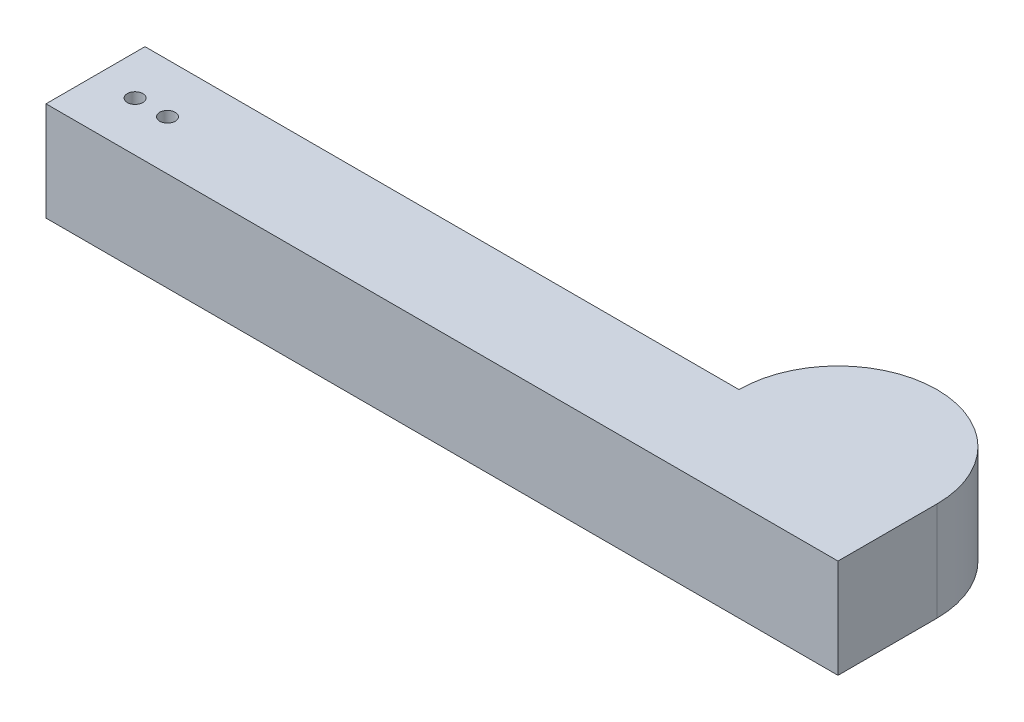
ISO-10303-21;
HEADER;
FILE_DESCRIPTION(('STEP AP214'),'2;1');
FILE_NAME('part.step','',(''),(''),'','','');
FILE_SCHEMA(('AUTOMOTIVE_DESIGN { 1 0 10303 214 1 1 1 1 }'));
ENDSEC;
DATA;
#1=APPLICATION_CONTEXT('core data for automotive mechanical design processes');
#2=APPLICATION_PROTOCOL_DEFINITION('international standard','automotive_design',2000,#1);
#3=PRODUCT_CONTEXT('',#1,'mechanical');
#4=PRODUCT('Part','Part','',(#3));
#5=PRODUCT_RELATED_PRODUCT_CATEGORY('part','',(#4));
#6=PRODUCT_DEFINITION_FORMATION('','',#4);
#7=PRODUCT_DEFINITION_CONTEXT('part definition',#1,'design');
#8=PRODUCT_DEFINITION('design','',#6,#7);
#9=PRODUCT_DEFINITION_SHAPE('','',#8);
#10=(LENGTH_UNIT() NAMED_UNIT(*) SI_UNIT(.MILLI.,.METRE.));
#11=(NAMED_UNIT(*) PLANE_ANGLE_UNIT() SI_UNIT($,.RADIAN.));
#12=(NAMED_UNIT(*) SI_UNIT($,.STERADIAN.) SOLID_ANGLE_UNIT());
#13=UNCERTAINTY_MEASURE_WITH_UNIT(LENGTH_MEASURE(1.E-05),#10,'distance_accuracy_value','');
#14=(GEOMETRIC_REPRESENTATION_CONTEXT(3) GLOBAL_UNCERTAINTY_ASSIGNED_CONTEXT((#13)) GLOBAL_UNIT_ASSIGNED_CONTEXT((#10,
#11,#12)) REPRESENTATION_CONTEXT('',''));
#15=CARTESIAN_POINT('',(0.,0.,0.));
#16=DIRECTION('',(0.,0.,1.));
#17=DIRECTION('',(1.,0.,0.));
#18=AXIS2_PLACEMENT_3D('',#15,#16,#17);
#19=CARTESIAN_POINT('',(0.,25.4,0.));
#20=DIRECTION('',(1.,0.,0.));
#21=DIRECTION('',(0.,0.,-1.));
#22=AXIS2_PLACEMENT_3D('',#19,#20,#21);
#23=PLANE('',#22);
#24=DIRECTION('',(0.,0.,1.));
#25=VECTOR('',#24,1.);
#26=CARTESIAN_POINT('',(0.,0.,0.));
#27=LINE('',#26,#25);
#28=CARTESIAN_POINT('',(0.,0.,-25.4));
#29=VERTEX_POINT('',#28);
#30=CARTESIAN_POINT('',(0.,0.,0.));
#31=VERTEX_POINT('',#30);
#32=EDGE_CURVE('E107',#29,#31,#27,.T.);
#33=ORIENTED_EDGE('',*,*,#32,.T.);
#34=DIRECTION('',(0.,-1.,0.));
#35=VECTOR('',#34,1.);
#36=CARTESIAN_POINT('',(0.,25.4,0.));
#37=LINE('',#36,#35);
#38=CARTESIAN_POINT('',(0.,25.4,0.));
#39=VERTEX_POINT('',#38);
#40=EDGE_CURVE('E11',#39,#31,#37,.T.);
#41=ORIENTED_EDGE('',*,*,#40,.F.);
#42=DIRECTION('',(0.,0.,1.));
#43=VECTOR('',#42,1.);
#44=CARTESIAN_POINT('',(0.,25.4,0.));
#45=LINE('',#44,#43);
#46=CARTESIAN_POINT('',(0.,25.4,-25.4));
#47=VERTEX_POINT('',#46);
#48=EDGE_CURVE('E116',#47,#39,#45,.T.);
#49=ORIENTED_EDGE('',*,*,#48,.F.);
#50=DIRECTION('',(0.,-1.,0.));
#51=VECTOR('',#50,1.);
#52=CARTESIAN_POINT('',(0.,25.4,-25.4));
#53=LINE('',#52,#51);
#54=EDGE_CURVE('E103',#47,#29,#53,.T.);
#55=ORIENTED_EDGE('',*,*,#54,.T.);
#56=EDGE_LOOP('',(#33,#41,#49,#55));
#57=FACE_BOUND('',#56,.T.);
#58=ADVANCED_FACE('F33',(#57),#23,.F.);
#59=CARTESIAN_POINT('',(0.,25.4,0.));
#60=DIRECTION('',(0.,0.,-1.));
#61=DIRECTION('',(-1.,0.,0.));
#62=AXIS2_PLACEMENT_3D('',#59,#60,#61);
#63=PLANE('',#62);
#64=DIRECTION('',(1.,0.,0.));
#65=VECTOR('',#64,1.);
#66=CARTESIAN_POINT('',(0.,0.,0.));
#67=LINE('',#66,#65);
#68=CARTESIAN_POINT('',(203.2,0.,0.));
#69=VERTEX_POINT('',#68);
#70=EDGE_CURVE('E110',#31,#69,#67,.T.);
#71=ORIENTED_EDGE('',*,*,#70,.T.);
#72=DIRECTION('',(0.,-1.,0.));
#73=VECTOR('',#72,1.);
#74=CARTESIAN_POINT('',(203.2,25.4,0.));
#75=LINE('',#74,#73);
#76=CARTESIAN_POINT('',(203.2,25.4,0.));
#77=VERTEX_POINT('',#76);
#78=EDGE_CURVE('E41',#77,#69,#75,.T.);
#79=ORIENTED_EDGE('',*,*,#78,.F.);
#80=DIRECTION('',(1.,0.,0.));
#81=VECTOR('',#80,1.);
#82=CARTESIAN_POINT('',(0.,25.4,0.));
#83=LINE('',#82,#81);
#84=EDGE_CURVE('E83',#39,#77,#83,.T.);
#85=ORIENTED_EDGE('',*,*,#84,.F.);
#86=ORIENTED_EDGE('',*,*,#40,.T.);
#87=EDGE_LOOP('',(#71,#79,#85,#86));
#88=FACE_BOUND('',#87,.T.);
#89=ADVANCED_FACE('F137',(#88),#63,.F.);
#90=CARTESIAN_POINT('',(203.2,25.4,0.));
#91=DIRECTION('',(-1.,0.,0.));
#92=DIRECTION('',(0.,0.,1.));
#93=AXIS2_PLACEMENT_3D('',#90,#91,#92);
#94=PLANE('',#93);
#95=DIRECTION('',(0.,0.,-1.));
#96=VECTOR('',#95,1.);
#97=CARTESIAN_POINT('',(203.2,0.,0.));
#98=LINE('',#97,#96);
#99=CARTESIAN_POINT('',(203.2,0.,-25.4));
#100=VERTEX_POINT('',#99);
#101=EDGE_CURVE('E98',#69,#100,#98,.T.);
#102=ORIENTED_EDGE('',*,*,#101,.T.);
#103=DIRECTION('',(0.,-1.,0.));
#104=VECTOR('',#103,1.);
#105=CARTESIAN_POINT('',(203.2,25.4,-25.4));
#106=LINE('',#105,#104);
#107=CARTESIAN_POINT('',(203.2,25.4,-25.4));
#108=VERTEX_POINT('',#107);
#109=EDGE_CURVE('E95',#108,#100,#106,.T.);
#110=ORIENTED_EDGE('',*,*,#109,.F.);
#111=DIRECTION('',(0.,0.,-1.));
#112=VECTOR('',#111,1.);
#113=CARTESIAN_POINT('',(203.2,25.4,0.));
#114=LINE('',#113,#112);
#115=EDGE_CURVE('E87',#77,#108,#114,.T.);
#116=ORIENTED_EDGE('',*,*,#115,.F.);
#117=ORIENTED_EDGE('',*,*,#78,.T.);
#118=EDGE_LOOP('',(#102,#110,#116,#117));
#119=FACE_BOUND('',#118,.T.);
#120=ADVANCED_FACE('F96',(#119),#94,.F.);
#121=CARTESIAN_POINT('',(177.8,25.4,-25.4));
#122=DIRECTION('',(0.,-1.,0.));
#123=DIRECTION('',(0.,0.,-1.));
#124=AXIS2_PLACEMENT_3D('',#121,#122,#123);
#125=CYLINDRICAL_SURFACE('',#124,25.4);
#126=CARTESIAN_POINT('',(177.8,0.,-25.4));
#127=DIRECTION('',(0.,1.,0.));
#128=DIRECTION('',(0.,0.,1.));
#129=AXIS2_PLACEMENT_3D('',#126,#127,#128);
#130=CIRCLE('',#129,25.4);
#131=CARTESIAN_POINT('',(152.4,0.,-25.4));
#132=VERTEX_POINT('',#131);
#133=EDGE_CURVE('E69',#100,#132,#130,.T.);
#134=ORIENTED_EDGE('',*,*,#133,.T.);
#135=DIRECTION('',(0.,-1.,0.));
#136=VECTOR('',#135,1.);
#137=CARTESIAN_POINT('',(152.4,25.4,-25.4));
#138=LINE('',#137,#136);
#139=CARTESIAN_POINT('',(152.4,25.4,-25.4));
#140=VERTEX_POINT('',#139);
#141=EDGE_CURVE('E99',#140,#132,#138,.T.);
#142=ORIENTED_EDGE('',*,*,#141,.F.);
#143=CARTESIAN_POINT('',(177.8,25.4,-25.4));
#144=DIRECTION('',(0.,1.,0.));
#145=DIRECTION('',(0.,0.,1.));
#146=AXIS2_PLACEMENT_3D('',#143,#144,#145);
#147=CIRCLE('',#146,25.4);
#148=EDGE_CURVE('E91',#108,#140,#147,.T.);
#149=ORIENTED_EDGE('',*,*,#148,.F.);
#150=ORIENTED_EDGE('',*,*,#109,.T.);
#151=EDGE_LOOP('',(#134,#142,#149,#150));
#152=FACE_BOUND('',#151,.T.);
#153=ADVANCED_FACE('F101',(#152),#125,.T.);
#154=CARTESIAN_POINT('',(0.,25.4,-25.4));
#155=DIRECTION('',(0.,0.,1.));
#156=DIRECTION('',(1.,0.,0.));
#157=AXIS2_PLACEMENT_3D('',#154,#155,#156);
#158=PLANE('',#157);
#159=DIRECTION('',(-1.,0.,0.));
#160=VECTOR('',#159,1.);
#161=CARTESIAN_POINT('',(0.,0.,-25.4));
#162=LINE('',#161,#160);
#163=EDGE_CURVE('E75',#132,#29,#162,.T.);
#164=ORIENTED_EDGE('',*,*,#163,.T.);
#165=ORIENTED_EDGE('',*,*,#54,.F.);
#166=DIRECTION('',(-1.,0.,0.));
#167=VECTOR('',#166,1.);
#168=CARTESIAN_POINT('',(0.,25.4,-25.4));
#169=LINE('',#168,#167);
#170=EDGE_CURVE('E49',#140,#47,#169,.T.);
#171=ORIENTED_EDGE('',*,*,#170,.F.);
#172=ORIENTED_EDGE('',*,*,#141,.T.);
#173=EDGE_LOOP('',(#164,#165,#171,#172));
#174=FACE_BOUND('',#173,.T.);
#175=ADVANCED_FACE('F124',(#174),#158,.F.);
#176=CARTESIAN_POINT('',(177.8,25.4,-25.4));
#177=DIRECTION('',(0.,1.,0.));
#178=DIRECTION('',(0.,0.,1.));
#179=AXIS2_PLACEMENT_3D('',#176,#177,#178);
#180=PLANE('',#179);
#181=CARTESIAN_POINT('',(18.4658,25.4,-12.7));
#182=DIRECTION('',(0.,1.,0.));
#183=DIRECTION('',(0.,0.,1.));
#184=AXIS2_PLACEMENT_3D('',#181,#182,#183);
#185=CIRCLE('',#184,1.99898);
#186=CARTESIAN_POINT('',(18.4658,25.4,-10.70102));
#187=VERTEX_POINT('',#186);
#188=EDGE_CURVE('E194',#187,#187,#185,.T.);
#189=ORIENTED_EDGE('',*,*,#188,.F.);
#190=EDGE_LOOP('',(#189));
#191=FACE_BOUND('',#190,.T.);
#192=CARTESIAN_POINT('',(10.16,25.4,-12.7));
#193=DIRECTION('',(0.,1.,0.));
#194=DIRECTION('',(0.,0.,1.));
#195=AXIS2_PLACEMENT_3D('',#192,#193,#194);
#196=CIRCLE('',#195,1.99898);
#197=CARTESIAN_POINT('',(10.16,25.4,-10.70102));
#198=VERTEX_POINT('',#197);
#199=EDGE_CURVE('E196',#198,#198,#196,.T.);
#200=ORIENTED_EDGE('',*,*,#199,.F.);
#201=EDGE_LOOP('',(#200));
#202=FACE_BOUND('',#201,.T.);
#203=ORIENTED_EDGE('',*,*,#48,.T.);
#204=ORIENTED_EDGE('',*,*,#84,.T.);
#205=ORIENTED_EDGE('',*,*,#115,.T.);
#206=ORIENTED_EDGE('',*,*,#148,.T.);
#207=ORIENTED_EDGE('',*,*,#170,.T.);
#208=EDGE_LOOP('',(#203,#204,#205,#206,#207));
#209=FACE_BOUND('',#208,.T.);
#210=ADVANCED_FACE('F89',(#191,#202,#209),#180,.T.);
#211=CARTESIAN_POINT('',(177.8,0.,-25.4));
#212=DIRECTION('',(0.,1.,0.));
#213=DIRECTION('',(0.,0.,1.));
#214=AXIS2_PLACEMENT_3D('',#211,#212,#213);
#215=PLANE('',#214);
#216=CARTESIAN_POINT('',(18.4658,0.,-12.7));
#217=DIRECTION('',(0.,1.,0.));
#218=DIRECTION('',(0.,0.,1.));
#219=AXIS2_PLACEMENT_3D('',#216,#217,#218);
#220=CIRCLE('',#219,1.99898);
#221=CARTESIAN_POINT('',(18.4658,0.,-10.70102));
#222=VERTEX_POINT('',#221);
#223=EDGE_CURVE('E191',#222,#222,#220,.T.);
#224=ORIENTED_EDGE('',*,*,#223,.T.);
#225=EDGE_LOOP('',(#224));
#226=FACE_BOUND('',#225,.T.);
#227=CARTESIAN_POINT('',(10.16,0.,-12.7));
#228=DIRECTION('',(0.,1.,0.));
#229=DIRECTION('',(0.,0.,1.));
#230=AXIS2_PLACEMENT_3D('',#227,#228,#229);
#231=CIRCLE('',#230,1.99898);
#232=CARTESIAN_POINT('',(10.16,0.,-10.70102));
#233=VERTEX_POINT('',#232);
#234=EDGE_CURVE('E111',#233,#233,#231,.T.);
#235=ORIENTED_EDGE('',*,*,#234,.T.);
#236=EDGE_LOOP('',(#235));
#237=FACE_BOUND('',#236,.T.);
#238=ORIENTED_EDGE('',*,*,#32,.F.);
#239=ORIENTED_EDGE('',*,*,#163,.F.);
#240=ORIENTED_EDGE('',*,*,#133,.F.);
#241=ORIENTED_EDGE('',*,*,#101,.F.);
#242=ORIENTED_EDGE('',*,*,#70,.F.);
#243=EDGE_LOOP('',(#238,#239,#240,#241,#242));
#244=FACE_BOUND('',#243,.T.);
#245=ADVANCED_FACE('F120',(#226,#237,#244),#215,.F.);
#246=CARTESIAN_POINT('',(10.16,0.,-12.7));
#247=DIRECTION('',(0.,1.,0.));
#248=DIRECTION('',(0.,0.,1.));
#249=AXIS2_PLACEMENT_3D('',#246,#247,#248);
#250=CYLINDRICAL_SURFACE('',#249,1.99898);
#251=CARTESIAN_POINT('',(10.16,0.,-10.70102));
#252=CARTESIAN_POINT('',(10.16,0.26458333333333,-10.70102));
#253=CARTESIAN_POINT('',(10.16,0.529166666666663,-10.70102));
#254=CARTESIAN_POINT('',(10.16,1.05833333333333,-10.70102));
#255=CARTESIAN_POINT('',(10.16,1.32291666666666,-10.70102));
#256=CARTESIAN_POINT('',(10.16,1.85208333333333,-10.70102));
#257=CARTESIAN_POINT('',(10.16,2.11666666666666,-10.70102));
#258=CARTESIAN_POINT('',(10.16,2.64583333333333,-10.70102));
#259=CARTESIAN_POINT('',(10.16,2.91041666666666,-10.70102));
#260=CARTESIAN_POINT('',(10.16,3.43958333333333,-10.70102));
#261=CARTESIAN_POINT('',(10.16,3.70416666666666,-10.70102));
#262=CARTESIAN_POINT('',(10.16,4.23333333333333,-10.70102));
#263=CARTESIAN_POINT('',(10.16,4.49791666666666,-10.70102));
#264=CARTESIAN_POINT('',(10.16,5.02708333333333,-10.70102));
#265=CARTESIAN_POINT('',(10.16,5.29166666666666,-10.70102));
#266=CARTESIAN_POINT('',(10.16,5.82083333333333,-10.70102));
#267=CARTESIAN_POINT('',(10.16,6.08541666666666,-10.70102));
#268=CARTESIAN_POINT('',(10.16,6.61458333333333,-10.70102));
#269=CARTESIAN_POINT('',(10.16,6.87916666666666,-10.70102));
#270=CARTESIAN_POINT('',(10.16,7.40833333333333,-10.70102));
#271=CARTESIAN_POINT('',(10.16,7.67291666666666,-10.70102));
#272=CARTESIAN_POINT('',(10.16,8.20208333333333,-10.70102));
#273=CARTESIAN_POINT('',(10.16,8.46666666666666,-10.70102));
#274=CARTESIAN_POINT('',(10.16,8.99583333333333,-10.70102));
#275=CARTESIAN_POINT('',(10.16,9.26041666666666,-10.70102));
#276=CARTESIAN_POINT('',(10.16,9.78958333333333,-10.70102));
#277=CARTESIAN_POINT('',(10.16,10.0541666666667,-10.70102));
#278=CARTESIAN_POINT('',(10.16,10.5833333333333,-10.70102));
#279=CARTESIAN_POINT('',(10.16,10.8479166666667,-10.70102));
#280=CARTESIAN_POINT('',(10.16,11.3770833333333,-10.70102));
#281=CARTESIAN_POINT('',(10.16,11.6416666666667,-10.70102));
#282=CARTESIAN_POINT('',(10.16,12.1708333333333,-10.70102));
#283=CARTESIAN_POINT('',(10.16,12.4354166666667,-10.70102));
#284=CARTESIAN_POINT('',(10.16,12.9645833333333,-10.70102));
#285=CARTESIAN_POINT('',(10.16,13.2291666666667,-10.70102));
#286=CARTESIAN_POINT('',(10.16,13.7583333333333,-10.70102));
#287=CARTESIAN_POINT('',(10.16,14.0229166666667,-10.70102));
#288=CARTESIAN_POINT('',(10.16,14.5520833333333,-10.70102));
#289=CARTESIAN_POINT('',(10.16,14.8166666666667,-10.70102));
#290=CARTESIAN_POINT('',(10.16,15.3458333333333,-10.70102));
#291=CARTESIAN_POINT('',(10.16,15.6104166666667,-10.70102));
#292=CARTESIAN_POINT('',(10.16,16.1395833333333,-10.70102));
#293=CARTESIAN_POINT('',(10.16,16.4041666666667,-10.70102));
#294=CARTESIAN_POINT('',(10.16,16.9333333333333,-10.70102));
#295=CARTESIAN_POINT('',(10.16,17.1979166666667,-10.70102));
#296=CARTESIAN_POINT('',(10.16,17.7270833333333,-10.70102));
#297=CARTESIAN_POINT('',(10.16,17.9916666666667,-10.70102));
#298=CARTESIAN_POINT('',(10.16,18.5208333333333,-10.70102));
#299=CARTESIAN_POINT('',(10.16,18.7854166666667,-10.70102));
#300=CARTESIAN_POINT('',(10.16,19.3145833333333,-10.70102));
#301=CARTESIAN_POINT('',(10.16,19.5791666666667,-10.70102));
#302=CARTESIAN_POINT('',(10.16,20.1083333333333,-10.70102));
#303=CARTESIAN_POINT('',(10.16,20.3729166666667,-10.70102));
#304=CARTESIAN_POINT('',(10.16,20.9020833333333,-10.70102));
#305=CARTESIAN_POINT('',(10.16,21.1666666666667,-10.70102));
#306=CARTESIAN_POINT('',(10.16,21.6958333333333,-10.70102));
#307=CARTESIAN_POINT('',(10.16,21.9604166666667,-10.70102));
#308=CARTESIAN_POINT('',(10.16,22.4895833333333,-10.70102));
#309=CARTESIAN_POINT('',(10.16,22.7541666666667,-10.70102));
#310=CARTESIAN_POINT('',(10.16,23.2833333333333,-10.70102));
#311=CARTESIAN_POINT('',(10.16,23.5479166666667,-10.70102));
#312=CARTESIAN_POINT('',(10.16,24.0770833333333,-10.70102));
#313=CARTESIAN_POINT('',(10.16,24.3416666666667,-10.70102));
#314=CARTESIAN_POINT('',(10.16,24.8708333333333,-10.70102));
#315=CARTESIAN_POINT('',(10.16,25.1354166666667,-10.70102));
#316=CARTESIAN_POINT('',(10.16,25.4,-10.70102));
#317=B_SPLINE_CURVE_WITH_KNOTS('',3,(#251,#252,#253,#254,#255,#256,#257,#258,#259,#260,#261,
#262,#263,#264,#265,#266,#267,#268,#269,#270,#271,#272,#273,#274,#275,#276,#277,#278,#279,#280,
#281,#282,#283,#284,#285,#286,#287,#288,#289,#290,#291,#292,#293,#294,#295,#296,#297,#298,#299,
#300,#301,#302,#303,#304,#305,#306,#307,#308,#309,#310,#311,#312,#313,#314,#315,#316),
.UNSPECIFIED.,.F.,.F.,(4,2,2,2,2,2,2,2,2,2,2,2,2,2,2,2,2,2,2,2,2,2,2,2,2,2,2,2,2,2,2,2,4),(0.,
0.79375,1.5875,2.38125,3.175,3.96875,4.7625,5.55625,6.35,7.14375,7.9375,8.73125,9.525,10.31875,
11.1125,11.90625,12.7,13.49375,14.2875,15.08125,15.875,16.66875,17.4625,18.25625,19.05,19.84375,
20.6375,21.43125,22.225,23.01875,23.8125,24.60625,25.4),.UNSPECIFIED.);
#318=EDGE_CURVE('BSEAM166',#233,#198,#317,.T.);
#319=ORIENTED_EDGE('',*,*,#234,.F.);
#320=ORIENTED_EDGE('',*,*,#199,.T.);
#321=ORIENTED_EDGE('',*,*,#318,.T.);
#322=ORIENTED_EDGE('',*,*,#318,.F.);
#323=EDGE_LOOP('',(#319,#321,#320,#322));
#324=FACE_BOUND('',#323,.T.);
#325=ADVANCED_FACE('F166',(#324),#250,.F.);
#326=CARTESIAN_POINT('',(18.4658,0.,-12.7));
#327=DIRECTION('',(0.,1.,0.));
#328=DIRECTION('',(0.,0.,1.));
#329=AXIS2_PLACEMENT_3D('',#326,#327,#328);
#330=CYLINDRICAL_SURFACE('',#329,1.99898);
#331=CARTESIAN_POINT('',(18.4658,0.,-10.70102));
#332=CARTESIAN_POINT('',(18.4658,0.26458333333333,-10.70102));
#333=CARTESIAN_POINT('',(18.4658,0.529166666666663,-10.70102));
#334=CARTESIAN_POINT('',(18.4658,1.05833333333333,-10.70102));
#335=CARTESIAN_POINT('',(18.4658,1.32291666666666,-10.70102));
#336=CARTESIAN_POINT('',(18.4658,1.85208333333333,-10.70102));
#337=CARTESIAN_POINT('',(18.4658,2.11666666666666,-10.70102));
#338=CARTESIAN_POINT('',(18.4658,2.64583333333333,-10.70102));
#339=CARTESIAN_POINT('',(18.4658,2.91041666666666,-10.70102));
#340=CARTESIAN_POINT('',(18.4658,3.43958333333333,-10.70102));
#341=CARTESIAN_POINT('',(18.4658,3.70416666666666,-10.70102));
#342=CARTESIAN_POINT('',(18.4658,4.23333333333333,-10.70102));
#343=CARTESIAN_POINT('',(18.4658,4.49791666666666,-10.70102));
#344=CARTESIAN_POINT('',(18.4658,5.02708333333333,-10.70102));
#345=CARTESIAN_POINT('',(18.4658,5.29166666666666,-10.70102));
#346=CARTESIAN_POINT('',(18.4658,5.82083333333333,-10.70102));
#347=CARTESIAN_POINT('',(18.4658,6.08541666666666,-10.70102));
#348=CARTESIAN_POINT('',(18.4658,6.61458333333333,-10.70102));
#349=CARTESIAN_POINT('',(18.4658,6.87916666666666,-10.70102));
#350=CARTESIAN_POINT('',(18.4658,7.40833333333333,-10.70102));
#351=CARTESIAN_POINT('',(18.4658,7.67291666666666,-10.70102));
#352=CARTESIAN_POINT('',(18.4658,8.20208333333333,-10.70102));
#353=CARTESIAN_POINT('',(18.4658,8.46666666666666,-10.70102));
#354=CARTESIAN_POINT('',(18.4658,8.99583333333333,-10.70102));
#355=CARTESIAN_POINT('',(18.4658,9.26041666666666,-10.70102));
#356=CARTESIAN_POINT('',(18.4658,9.78958333333333,-10.70102));
#357=CARTESIAN_POINT('',(18.4658,10.0541666666667,-10.70102));
#358=CARTESIAN_POINT('',(18.4658,10.5833333333333,-10.70102));
#359=CARTESIAN_POINT('',(18.4658,10.8479166666667,-10.70102));
#360=CARTESIAN_POINT('',(18.4658,11.3770833333333,-10.70102));
#361=CARTESIAN_POINT('',(18.4658,11.6416666666667,-10.70102));
#362=CARTESIAN_POINT('',(18.4658,12.1708333333333,-10.70102));
#363=CARTESIAN_POINT('',(18.4658,12.4354166666667,-10.70102));
#364=CARTESIAN_POINT('',(18.4658,12.9645833333333,-10.70102));
#365=CARTESIAN_POINT('',(18.4658,13.2291666666667,-10.70102));
#366=CARTESIAN_POINT('',(18.4658,13.7583333333333,-10.70102));
#367=CARTESIAN_POINT('',(18.4658,14.0229166666667,-10.70102));
#368=CARTESIAN_POINT('',(18.4658,14.5520833333333,-10.70102));
#369=CARTESIAN_POINT('',(18.4658,14.8166666666667,-10.70102));
#370=CARTESIAN_POINT('',(18.4658,15.3458333333333,-10.70102));
#371=CARTESIAN_POINT('',(18.4658,15.6104166666667,-10.70102));
#372=CARTESIAN_POINT('',(18.4658,16.1395833333333,-10.70102));
#373=CARTESIAN_POINT('',(18.4658,16.4041666666667,-10.70102));
#374=CARTESIAN_POINT('',(18.4658,16.9333333333333,-10.70102));
#375=CARTESIAN_POINT('',(18.4658,17.1979166666667,-10.70102));
#376=CARTESIAN_POINT('',(18.4658,17.7270833333333,-10.70102));
#377=CARTESIAN_POINT('',(18.4658,17.9916666666667,-10.70102));
#378=CARTESIAN_POINT('',(18.4658,18.5208333333333,-10.70102));
#379=CARTESIAN_POINT('',(18.4658,18.7854166666667,-10.70102));
#380=CARTESIAN_POINT('',(18.4658,19.3145833333333,-10.70102));
#381=CARTESIAN_POINT('',(18.4658,19.5791666666667,-10.70102));
#382=CARTESIAN_POINT('',(18.4658,20.1083333333333,-10.70102));
#383=CARTESIAN_POINT('',(18.4658,20.3729166666667,-10.70102));
#384=CARTESIAN_POINT('',(18.4658,20.9020833333333,-10.70102));
#385=CARTESIAN_POINT('',(18.4658,21.1666666666667,-10.70102));
#386=CARTESIAN_POINT('',(18.4658,21.6958333333333,-10.70102));
#387=CARTESIAN_POINT('',(18.4658,21.9604166666667,-10.70102));
#388=CARTESIAN_POINT('',(18.4658,22.4895833333333,-10.70102));
#389=CARTESIAN_POINT('',(18.4658,22.7541666666667,-10.70102));
#390=CARTESIAN_POINT('',(18.4658,23.2833333333333,-10.70102));
#391=CARTESIAN_POINT('',(18.4658,23.5479166666667,-10.70102));
#392=CARTESIAN_POINT('',(18.4658,24.0770833333333,-10.70102));
#393=CARTESIAN_POINT('',(18.4658,24.3416666666667,-10.70102));
#394=CARTESIAN_POINT('',(18.4658,24.8708333333333,-10.70102));
#395=CARTESIAN_POINT('',(18.4658,25.1354166666667,-10.70102));
#396=CARTESIAN_POINT('',(18.4658,25.4,-10.70102));
#397=B_SPLINE_CURVE_WITH_KNOTS('',3,(#331,#332,#333,#334,#335,#336,#337,#338,#339,#340,#341,
#342,#343,#344,#345,#346,#347,#348,#349,#350,#351,#352,#353,#354,#355,#356,#357,#358,#359,#360,
#361,#362,#363,#364,#365,#366,#367,#368,#369,#370,#371,#372,#373,#374,#375,#376,#377,#378,#379,
#380,#381,#382,#383,#384,#385,#386,#387,#388,#389,#390,#391,#392,#393,#394,#395,#396),
.UNSPECIFIED.,.F.,.F.,(4,2,2,2,2,2,2,2,2,2,2,2,2,2,2,2,2,2,2,2,2,2,2,2,2,2,2,2,2,2,2,2,4),(0.,
0.79375,1.5875,2.38125,3.175,3.96875,4.7625,5.55625,6.35,7.14375,7.9375,8.73125,9.525,10.31875,
11.1125,11.90625,12.7,13.49375,14.2875,15.08125,15.875,16.66875,17.4625,18.25625,19.05,19.84375,
20.6375,21.43125,22.225,23.01875,23.8125,24.60625,25.4),.UNSPECIFIED.);
#398=EDGE_CURVE('BSEAM174',#222,#187,#397,.T.);
#399=ORIENTED_EDGE('',*,*,#223,.F.);
#400=ORIENTED_EDGE('',*,*,#188,.T.);
#401=ORIENTED_EDGE('',*,*,#398,.T.);
#402=ORIENTED_EDGE('',*,*,#398,.F.);
#403=EDGE_LOOP('',(#399,#401,#400,#402));
#404=FACE_BOUND('',#403,.T.);
#405=ADVANCED_FACE('F174',(#404),#330,.F.);
#406=CLOSED_SHELL('',(#58,#89,#120,#153,#175,#210,#245,#325,#405));
#407=MANIFOLD_SOLID_BREP('B2',#406);
#408=ADVANCED_BREP_SHAPE_REPRESENTATION('',(#18,#407),#14);
#409=SHAPE_DEFINITION_REPRESENTATION(#9,#408);
ENDSEC;
END-ISO-10303-21;
